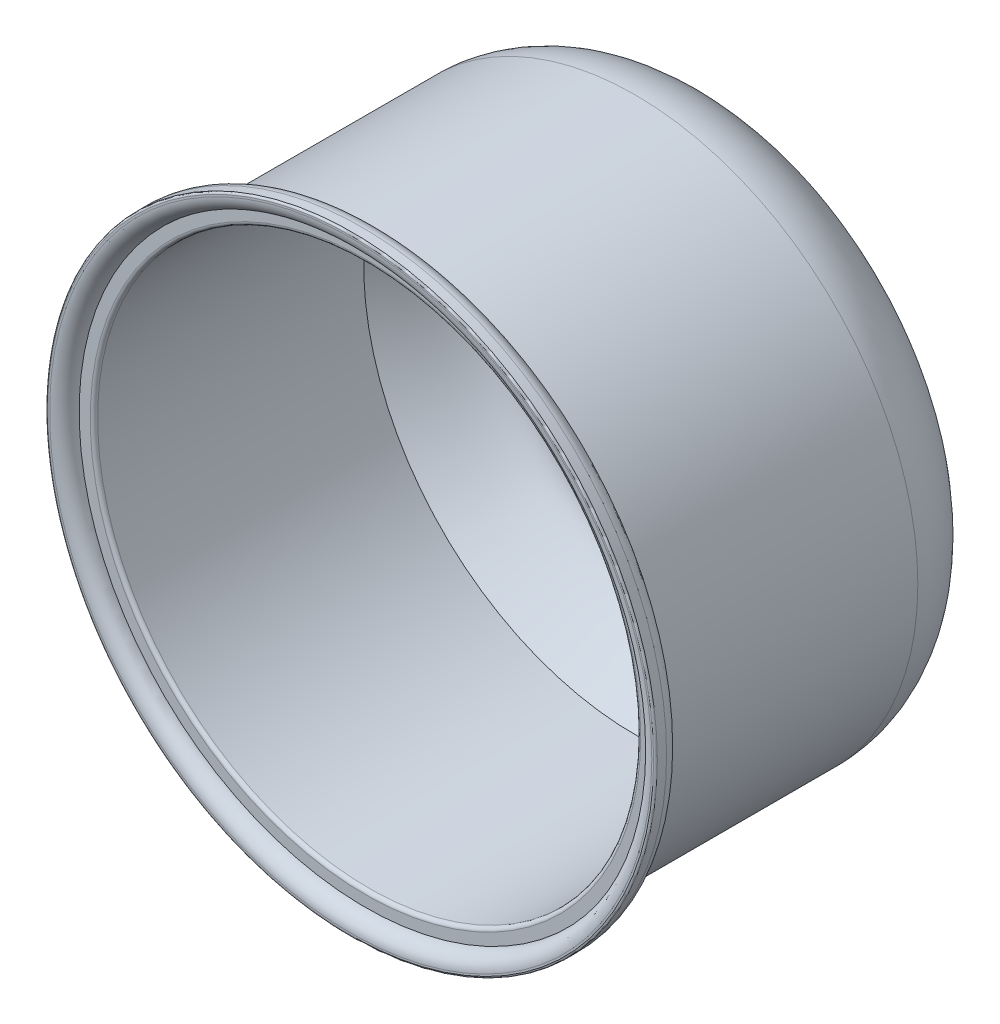
ISO-10303-21;
HEADER;
FILE_DESCRIPTION(('STEP AP214'),'2;1');
FILE_NAME('part.step','',(''),(''),'','','');
FILE_SCHEMA(('AUTOMOTIVE_DESIGN { 1 0 10303 214 1 1 1 1 }'));
ENDSEC;
DATA;
#1=APPLICATION_CONTEXT('core data for automotive mechanical design processes');
#2=APPLICATION_PROTOCOL_DEFINITION('international standard','automotive_design',2000,#1);
#3=PRODUCT_CONTEXT('',#1,'mechanical');
#4=PRODUCT('Part','Part','',(#3));
#5=PRODUCT_RELATED_PRODUCT_CATEGORY('part','',(#4));
#6=PRODUCT_DEFINITION_FORMATION('','',#4);
#7=PRODUCT_DEFINITION_CONTEXT('part definition',#1,'design');
#8=PRODUCT_DEFINITION('design','',#6,#7);
#9=PRODUCT_DEFINITION_SHAPE('','',#8);
#10=(LENGTH_UNIT() NAMED_UNIT(*) SI_UNIT(.MILLI.,.METRE.));
#11=(NAMED_UNIT(*) PLANE_ANGLE_UNIT() SI_UNIT($,.RADIAN.));
#12=(NAMED_UNIT(*) SI_UNIT($,.STERADIAN.) SOLID_ANGLE_UNIT());
#13=UNCERTAINTY_MEASURE_WITH_UNIT(LENGTH_MEASURE(1.E-05),#10,'distance_accuracy_value','');
#14=(GEOMETRIC_REPRESENTATION_CONTEXT(3) GLOBAL_UNCERTAINTY_ASSIGNED_CONTEXT((#13)) GLOBAL_UNIT_ASSIGNED_CONTEXT((#10,
#11,#12)) REPRESENTATION_CONTEXT('',''));
#15=CARTESIAN_POINT('',(0.,0.,0.));
#16=DIRECTION('',(0.,0.,1.));
#17=DIRECTION('',(1.,0.,0.));
#18=AXIS2_PLACEMENT_3D('',#15,#16,#17);
#19=CARTESIAN_POINT('',(0.,0.,100.));
#20=DIRECTION('',(0.,0.,-1.));
#21=DIRECTION('',(-1.,0.,0.));
#22=AXIS2_PLACEMENT_3D('',#19,#20,#21);
#23=CYLINDRICAL_SURFACE('',#22,82.5);
#24=CARTESIAN_POINT('',(0.,0.,99.5));
#25=DIRECTION('',(0.,0.,1.));
#26=DIRECTION('',(1.,0.,0.));
#27=AXIS2_PLACEMENT_3D('',#24,#25,#26);
#28=CIRCLE('',#27,82.5);
#29=CARTESIAN_POINT('',(-82.5,0.,99.5));
#30=VERTEX_POINT('',#29);
#31=EDGE_CURVE('E11',#30,#30,#28,.F.);
#32=CARTESIAN_POINT('',(0.,0.,97.));
#33=DIRECTION('',(0.,0.,-1.));
#34=DIRECTION('',(-1.,0.,0.));
#35=AXIS2_PLACEMENT_3D('',#32,#33,#34);
#36=CIRCLE('',#35,82.5);
#37=CARTESIAN_POINT('',(-82.5,0.,97.));
#38=VERTEX_POINT('',#37);
#39=EDGE_CURVE('E59',#38,#38,#36,.F.);
#40=CARTESIAN_POINT('',(-82.5,0.,99.5));
#41=CARTESIAN_POINT('',(-82.5,0.,99.4739583333333));
#42=CARTESIAN_POINT('',(-82.5,0.,99.4479166666666));
#43=CARTESIAN_POINT('',(-82.5,0.,99.3958333333333));
#44=CARTESIAN_POINT('',(-82.5,0.,99.3697916666667));
#45=CARTESIAN_POINT('',(-82.5,0.,99.3177083333333));
#46=CARTESIAN_POINT('',(-82.5,0.,99.2916666666667));
#47=CARTESIAN_POINT('',(-82.5,0.,99.2395833333333));
#48=CARTESIAN_POINT('',(-82.5,0.,99.2135416666667));
#49=CARTESIAN_POINT('',(-82.5,0.,99.1614583333333));
#50=CARTESIAN_POINT('',(-82.5,0.,99.1354166666667));
#51=CARTESIAN_POINT('',(-82.5,0.,99.0833333333333));
#52=CARTESIAN_POINT('',(-82.5,0.,99.0572916666667));
#53=CARTESIAN_POINT('',(-82.5,0.,99.0052083333333));
#54=CARTESIAN_POINT('',(-82.5,0.,98.9791666666667));
#55=CARTESIAN_POINT('',(-82.5,0.,98.9270833333333));
#56=CARTESIAN_POINT('',(-82.5,0.,98.9010416666667));
#57=CARTESIAN_POINT('',(-82.5,0.,98.8489583333333));
#58=CARTESIAN_POINT('',(-82.5,0.,98.8229166666667));
#59=CARTESIAN_POINT('',(-82.5,0.,98.7708333333333));
#60=CARTESIAN_POINT('',(-82.5,0.,98.7447916666667));
#61=CARTESIAN_POINT('',(-82.5,0.,98.6927083333333));
#62=CARTESIAN_POINT('',(-82.5,0.,98.6666666666667));
#63=CARTESIAN_POINT('',(-82.5,0.,98.6145833333333));
#64=CARTESIAN_POINT('',(-82.5,0.,98.5885416666667));
#65=CARTESIAN_POINT('',(-82.5,0.,98.5364583333333));
#66=CARTESIAN_POINT('',(-82.5,0.,98.5104166666667));
#67=CARTESIAN_POINT('',(-82.5,0.,98.4583333333333));
#68=CARTESIAN_POINT('',(-82.5,0.,98.4322916666667));
#69=CARTESIAN_POINT('',(-82.5,0.,98.3802083333333));
#70=CARTESIAN_POINT('',(-82.5,0.,98.3541666666667));
#71=CARTESIAN_POINT('',(-82.5,0.,98.3020833333333));
#72=CARTESIAN_POINT('',(-82.5,0.,98.2760416666667));
#73=CARTESIAN_POINT('',(-82.5,0.,98.2239583333333));
#74=CARTESIAN_POINT('',(-82.5,0.,98.1979166666667));
#75=CARTESIAN_POINT('',(-82.5,0.,98.1458333333333));
#76=CARTESIAN_POINT('',(-82.5,0.,98.1197916666667));
#77=CARTESIAN_POINT('',(-82.5,0.,98.0677083333333));
#78=CARTESIAN_POINT('',(-82.5,0.,98.0416666666667));
#79=CARTESIAN_POINT('',(-82.5,0.,97.9895833333333));
#80=CARTESIAN_POINT('',(-82.5,0.,97.9635416666667));
#81=CARTESIAN_POINT('',(-82.5,0.,97.9114583333333));
#82=CARTESIAN_POINT('',(-82.5,0.,97.8854166666667));
#83=CARTESIAN_POINT('',(-82.5,0.,97.8333333333333));
#84=CARTESIAN_POINT('',(-82.5,0.,97.8072916666667));
#85=CARTESIAN_POINT('',(-82.5,0.,97.7552083333333));
#86=CARTESIAN_POINT('',(-82.5,0.,97.7291666666667));
#87=CARTESIAN_POINT('',(-82.5,0.,97.6770833333333));
#88=CARTESIAN_POINT('',(-82.5,0.,97.6510416666667));
#89=CARTESIAN_POINT('',(-82.5,0.,97.5989583333333));
#90=CARTESIAN_POINT('',(-82.5,0.,97.5729166666667));
#91=CARTESIAN_POINT('',(-82.5,0.,97.5208333333333));
#92=CARTESIAN_POINT('',(-82.5,0.,97.4947916666667));
#93=CARTESIAN_POINT('',(-82.5,0.,97.4427083333333));
#94=CARTESIAN_POINT('',(-82.5,0.,97.4166666666667));
#95=CARTESIAN_POINT('',(-82.5,0.,97.3645833333333));
#96=CARTESIAN_POINT('',(-82.5,0.,97.3385416666667));
#97=CARTESIAN_POINT('',(-82.5,0.,97.2864583333333));
#98=CARTESIAN_POINT('',(-82.5,0.,97.2604166666667));
#99=CARTESIAN_POINT('',(-82.5,0.,97.2083333333333));
#100=CARTESIAN_POINT('',(-82.5,0.,97.1822916666667));
#101=CARTESIAN_POINT('',(-82.5,0.,97.1302083333333));
#102=CARTESIAN_POINT('',(-82.5,0.,97.1041666666667));
#103=CARTESIAN_POINT('',(-82.5,0.,97.0520833333333));
#104=CARTESIAN_POINT('',(-82.5,0.,97.0260416666667));
#105=CARTESIAN_POINT('',(-82.5,0.,97.));
#106=B_SPLINE_CURVE_WITH_KNOTS('',3,(#40,#41,#42,#43,#44,#45,#46,#47,#48,#49,#50,#51,#52,#53,
#54,#55,#56,#57,#58,#59,#60,#61,#62,#63,#64,#65,#66,#67,#68,#69,#70,#71,#72,#73,#74,#75,#76,#77,
#78,#79,#80,#81,#82,#83,#84,#85,#86,#87,#88,#89,#90,#91,#92,#93,#94,#95,#96,#97,#98,#99,#100,
#101,#102,#103,#104,#105),.UNSPECIFIED.,.F.,.F.,(4,2,2,2,2,2,2,2,2,2,2,2,2,2,2,2,2,2,2,2,2,2,2,
2,2,2,2,2,2,2,2,2,4),(0.,0.0781250000000122,0.156250000000011,0.234375000000009,
0.312500000000007,0.390625000000006,0.468750000000004,0.546875000000002,0.625000000000001,
0.703124999999999,0.781249999999997,0.859374999999996,0.937499999999994,1.01562499999999,
1.09374999999999,1.17187499999999,1.24999999999999,1.328125,1.40625,1.484375,1.56249999999999,
1.64062499999999,1.71874999999999,1.79687499999999,1.87499999999999,1.95312499999999,
2.03124999999998,2.10937499999998,2.18749999999998,2.26562499999998,2.34374999999998,
2.42187499999998,2.49999999999997),.UNSPECIFIED.);
#107=EDGE_CURVE('BSEAM48',#30,#38,#106,.T.);
#108=ORIENTED_EDGE('',*,*,#31,.T.);
#109=ORIENTED_EDGE('',*,*,#39,.T.);
#110=ORIENTED_EDGE('',*,*,#107,.T.);
#111=ORIENTED_EDGE('',*,*,#107,.F.);
#112=EDGE_LOOP('',(#108,#110,#109,#111));
#113=FACE_BOUND('',#112,.T.);
#114=ADVANCED_FACE('F48',(#113),#23,.T.);
#115=CARTESIAN_POINT('',(0.,0.,100.));
#116=DIRECTION('',(0.,0.,1.));
#117=DIRECTION('',(1.,0.,0.));
#118=AXIS2_PLACEMENT_3D('',#115,#116,#117);
#119=PLANE('',#118);
#120=CARTESIAN_POINT('',(0.,0.,100.));
#121=DIRECTION('',(0.,0.,1.));
#122=DIRECTION('',(1.,0.,0.));
#123=AXIS2_PLACEMENT_3D('',#120,#121,#122);
#124=CIRCLE('',#123,82.);
#125=CARTESIAN_POINT('',(82.,0.,100.));
#126=VERTEX_POINT('',#125);
#127=EDGE_CURVE('E55',#126,#126,#124,.T.);
#128=ORIENTED_EDGE('',*,*,#127,.T.);
#129=EDGE_LOOP('',(#128));
#130=FACE_BOUND('',#129,.T.);
#131=CARTESIAN_POINT('',(0.,0.,100.));
#132=DIRECTION('',(0.,0.,1.));
#133=DIRECTION('',(1.,0.,0.));
#134=AXIS2_PLACEMENT_3D('',#131,#132,#133);
#135=CIRCLE('',#134,81.5);
#136=CARTESIAN_POINT('',(81.5,0.,100.));
#137=VERTEX_POINT('',#136);
#138=EDGE_CURVE('E74',#137,#137,#135,.F.);
#139=ORIENTED_EDGE('',*,*,#138,.T.);
#140=EDGE_LOOP('',(#139));
#141=FACE_BOUND('',#140,.T.);
#142=ADVANCED_FACE('F113',(#130,#141),#119,.T.);
#143=CARTESIAN_POINT('',(0.,0.,96.));
#144=DIRECTION('',(0.,0.,1.));
#145=DIRECTION('',(1.,0.,0.));
#146=AXIS2_PLACEMENT_3D('',#143,#144,#145);
#147=PLANE('',#146);
#148=CARTESIAN_POINT('',(0.,0.,96.));
#149=DIRECTION('',(0.,0.,1.));
#150=DIRECTION('',(1.,0.,0.));
#151=AXIS2_PLACEMENT_3D('',#148,#149,#150);
#152=CIRCLE('',#151,74.5);
#153=CARTESIAN_POINT('',(74.5,0.,96.));
#154=VERTEX_POINT('',#153);
#155=EDGE_CURVE('E80',#154,#154,#152,.F.);
#156=ORIENTED_EDGE('',*,*,#155,.T.);
#157=EDGE_LOOP('',(#156));
#158=FACE_BOUND('',#157,.T.);
#159=CARTESIAN_POINT('',(0.,0.,96.));
#160=DIRECTION('',(0.,0.,1.));
#161=DIRECTION('',(1.,0.,0.));
#162=AXIS2_PLACEMENT_3D('',#159,#160,#161);
#163=CIRCLE('',#162,77.5);
#164=CARTESIAN_POINT('',(77.5,0.,96.));
#165=VERTEX_POINT('',#164);
#166=EDGE_CURVE('E135',#165,#165,#163,.T.);
#167=ORIENTED_EDGE('',*,*,#166,.T.);
#168=EDGE_LOOP('',(#167));
#169=FACE_BOUND('',#168,.T.);
#170=ADVANCED_FACE('F111',(#158,#169),#147,.T.);
#171=CARTESIAN_POINT('',(0.,0.,2.99999999999999));
#172=DIRECTION('',(0.,0.,1.));
#173=DIRECTION('',(1.,0.,0.));
#174=AXIS2_PLACEMENT_3D('',#171,#172,#173);
#175=PLANE('',#174);
#176=CARTESIAN_POINT('',(-46.6209359721925,-26.243824589353,2.99999999999999));
#177=CARTESIAN_POINT('',(-50.2749874513912,-19.752571781638,2.99999999999999));
#178=CARTESIAN_POINT('',(-52.7354392961135,-12.7423103192489,2.99999999999999));
#179=CARTESIAN_POINT('',(-53.9762857381079,-5.42869766770608,2.99999999999999));
#180=CARTESIAN_POINT('',(-53.9708403335559,3.02993818963954,2.99999999999999));
#181=CARTESIAN_POINT('',(-52.3045074981745,11.3214377310532,2.99999999999999));
#182=CARTESIAN_POINT('',(-52.0716533077258,12.3493977974518,2.99999999999999));
#183=CARTESIAN_POINT('',(-49.9765621798691,20.6259205836867,2.99999999999999));
#184=CARTESIAN_POINT('',(-46.2997607698573,28.279412700409,2.99999999999999));
#185=CARTESIAN_POINT('',(-42.0056666025258,34.3283287348322,2.99999999999999));
#186=CARTESIAN_POINT('',(-36.0206573457235,40.3056370266641,2.99999999999999));
#187=CARTESIAN_POINT('',(-28.9794065461727,44.9903373309908,2.99999999999999));
#188=CARTESIAN_POINT('',(-28.0878762353394,45.5525620876363,2.99999999999999));
#189=CARTESIAN_POINT('',(-20.7540377048363,49.9234943307166,2.99999999999999));
#190=CARTESIAN_POINT('',(-12.7423103192492,52.7354392961134,2.99999999999999));
#191=CARTESIAN_POINT('',(-5.42869766770606,53.9762857381082,2.99999999999999));
#192=CARTESIAN_POINT('',(3.02993818963956,53.9708403335559,2.99999999999999));
#193=CARTESIAN_POINT('',(11.3214377310533,52.3045074981745,2.99999999999999));
#194=CARTESIAN_POINT('',(12.3493977974519,52.0716533077258,2.99999999999999));
#195=CARTESIAN_POINT('',(21.6604859319662,49.7146757888869,2.99999999999999));
#196=CARTESIAN_POINT('',(30.1830508753785,45.3558461941964,2.99999999999999));
#197=CARTESIAN_POINT('',(36.8805564153776,40.0997992841534,2.99999999999999));
#198=CARTESIAN_POINT('',(42.4448771388227,33.6623992267415,2.99999999999999));
#199=CARTESIAN_POINT('',(50.2749874513912,19.752571781638,2.99999999999999));
#200=CARTESIAN_POINT('',(52.7354392961133,12.7423103192491,2.99999999999999));
#201=CARTESIAN_POINT('',(53.9762857381079,5.42869766770607,2.99999999999999));
#202=CARTESIAN_POINT('',(53.9708403335559,-3.02993818963954,2.99999999999999));
#203=CARTESIAN_POINT('',(52.3045074981745,-11.3214377310532,2.99999999999999));
#204=CARTESIAN_POINT('',(52.0716533077258,-12.3493977974518,2.99999999999999));
#205=CARTESIAN_POINT('',(49.9765621798691,-20.6259205836867,2.99999999999999));
#206=CARTESIAN_POINT('',(46.2997607698573,-28.279412700409,2.99999999999999));
#207=CARTESIAN_POINT('',(42.0056666025258,-34.3283287348324,2.99999999999999));
#208=CARTESIAN_POINT('',(36.0206573457237,-40.3056370266639,2.99999999999999));
#209=CARTESIAN_POINT('',(28.9794065461729,-44.9903373309907,2.99999999999999));
#210=CARTESIAN_POINT('',(28.0878762353395,-45.5525620876362,2.99999999999999));
#211=CARTESIAN_POINT('',(20.7540377048364,-49.9234943307166,2.99999999999999));
#212=CARTESIAN_POINT('',(12.7423103192497,-52.735439296113,2.99999999999999));
#213=CARTESIAN_POINT('',(5.42869766770613,-53.9762857381079,2.99999999999999));
#214=CARTESIAN_POINT('',(-3.02993818963937,-53.9708403335559,2.99999999999999));
#215=CARTESIAN_POINT('',(-11.3214377310531,-52.3045074981745,2.99999999999999));
#216=CARTESIAN_POINT('',(-12.3493977974517,-52.0716533077258,2.99999999999999));
#217=CARTESIAN_POINT('',(-21.660485931966,-49.714675788887,2.99999999999999));
#218=CARTESIAN_POINT('',(-30.1830508753781,-45.3558461941957,2.99999999999999));
#219=CARTESIAN_POINT('',(-36.8805564153775,-40.0997992841533,2.99999999999999));
#220=CARTESIAN_POINT('',(-42.4448771388225,-33.6623992267416,2.99999999999999));
#221=CARTESIAN_POINT('',(-46.6209359721925,-26.243824589353,2.99999999999999));
#222=B_SPLINE_CURVE_WITH_KNOTS('',5,(#176,#177,#178,#179,#180,#181,#182,#183,#184,#185,#186,
#187,#188,#189,#190,#191,#192,#193,#194,#195,#196,#197,#198,#199,#200,#201,#202,#203,#204,#205,
#206,#207,#208,#209,#210,#211,#212,#213,#214,#215,#216,#217,#218,#219,#220,#221),.UNSPECIFIED.,
.T.,.F.,(6,3,3,3,3,3,3,4,3,3,3,3,3,3,6),(0.,0.109375,0.125,0.234375,0.25,0.359375,0.375,0.5,
0.609375,0.625,0.734375,0.75,0.859375,0.875,1.),.UNSPECIFIED.);
#223=CARTESIAN_POINT('',(53.5000244055218,8.64352643278887E-10,2.99999999999999));
#224=VERTEX_POINT('',#223);
#225=EDGE_CURVE('E83',#224,#224,#222,.F.);
#226=ORIENTED_EDGE('',*,*,#225,.T.);
#227=EDGE_LOOP('',(#226));
#228=FACE_BOUND('',#227,.T.);
#229=ADVANCED_FACE('F107',(#228),#175,.T.);
#230=CARTESIAN_POINT('',(-46.6209359721925,-26.243824589353,2.99999999999999));
#231=CARTESIAN_POINT('',(-50.2504815493647,-28.2869658408111,2.99999999999999));
#232=CARTESIAN_POINT('',(-53.8800271265369,-30.3301070922691,2.99999999999999));
#233=CARTESIAN_POINT('',(-57.0672571945108,-32.4825001424338,11.));
#234=CARTESIAN_POINT('',(-60.3650661397843,-34.6075802429219,17.));
#235=CARTESIAN_POINT('',(-63.6628750850579,-36.7326603434099,23.));
#236=CARTESIAN_POINT('',(-42.4448771388225,-33.6623992267416,2.99999999999999));
#237=CARTESIAN_POINT('',(-45.749742571239,-36.2823179896097,2.99999999999999));
#238=CARTESIAN_POINT('',(-49.0546080036554,-38.9022367524777,2.99999999999999));
#239=CARTESIAN_POINT('',(-51.8989021827028,-41.5625743770355,11.));
#240=CARTESIAN_POINT('',(-54.8583391750925,-44.2128072861709,17.));
#241=CARTESIAN_POINT('',(-57.8177761674822,-46.8630401953062,23.));
#242=CARTESIAN_POINT('',(-36.8805564153775,-40.0997992841533,2.99999999999999));
#243=CARTESIAN_POINT('',(-39.7652187620559,-43.1477805726425,2.99999999999999));
#244=CARTESIAN_POINT('',(-42.6498811087342,-46.1957618611317,2.99999999999999));
#245=CARTESIAN_POINT('',(-45.0449400223251,-49.3579711225839,11.));
#246=CARTESIAN_POINT('',(-47.5623997941879,-52.4916233907954,17.));
#247=CARTESIAN_POINT('',(-50.0798595660507,-55.6252756590069,23.));
#248=CARTESIAN_POINT('',(-30.1830508753781,-45.3558461941957,2.99999999999999));
#249=CARTESIAN_POINT('',(-32.5746718551765,-48.6959446553221,2.99999999999999));
#250=CARTESIAN_POINT('',(-34.9662928349749,-52.0360431164485,2.99999999999999));
#251=CARTESIAN_POINT('',(-36.8224349694914,-55.6528427987044,11.));
#252=CARTESIAN_POINT('',(-38.8124468153284,-59.2004671756778,17.));
#253=CARTESIAN_POINT('',(-40.8024586611654,-62.7480915526513,23.));
#254=CARTESIAN_POINT('',(-21.660485931966,-49.714675788887,2.99999999999999));
#255=CARTESIAN_POINT('',(-23.4410125500605,-53.2448333840287,2.99999999999999));
#256=CARTESIAN_POINT('',(-25.221539168155,-56.7749909791704,2.99999999999999));
#257=CARTESIAN_POINT('',(-26.3892033191668,-60.8036542033107,11.));
#258=CARTESIAN_POINT('',(-27.7100830869494,-64.7076910202014,17.));
#259=CARTESIAN_POINT('',(-29.0309628547319,-68.611727837092,23.));
#260=CARTESIAN_POINT('',(-12.3493977974517,-52.0716533077258,2.99999999999999));
#261=CARTESIAN_POINT('',(-13.4840646494936,-55.6521373325497,2.99999999999999));
#262=CARTESIAN_POINT('',(-14.6187315015354,-59.2326213573736,2.99999999999999));
#263=CARTESIAN_POINT('',(-15.0264784688634,-63.5089993790976,11.));
#264=CARTESIAN_POINT('',(-15.6159554073699,-67.6114039015965,17.));
#265=CARTESIAN_POINT('',(-16.2054323458763,-71.7138084240955,23.));
#266=CARTESIAN_POINT('',(-11.3214377310531,-52.3045074981745,2.99999999999999));
#267=CARTESIAN_POINT('',(-12.3839574903203,-55.8888831940925,2.99999999999999));
#268=CARTESIAN_POINT('',(-13.4464772495875,-59.4732588900105,2.99999999999999));
#269=CARTESIAN_POINT('',(-13.7713307772548,-63.7745591107291,11.));
#270=CARTESIAN_POINT('',(-14.2806008628221,-67.8966282002476,17.));
#271=CARTESIAN_POINT('',(-14.7898709483893,-72.0186972897661,23.));
#272=CARTESIAN_POINT('',(-3.02993818963937,-53.9708403335559,2.99999999999999));
#273=CARTESIAN_POINT('',(-3.51255648214684,-57.57294768833,2.99999999999999));
#274=CARTESIAN_POINT('',(-3.99517477465431,-61.1750550431041,2.99999999999999));
#275=CARTESIAN_POINT('',(-3.65061304843024,-65.6593616431291,11.));
#276=CARTESIAN_POINT('',(-3.51284632688906,-69.9231184318414,17.));
#277=CARTESIAN_POINT('',(-3.37507960534788,-74.1868752205537,23.));
#278=CARTESIAN_POINT('',(5.42869766770613,-53.9762857381079,2.99999999999999));
#279=CARTESIAN_POINT('',(5.54494305597892,-57.4905072766655,2.99999999999999));
#280=CARTESIAN_POINT('',(5.66118844425171,-61.0047288152232,2.99999999999999));
#281=CARTESIAN_POINT('',(6.67149895958693,-65.5283784705192,11.));
#282=CARTESIAN_POINT('',(7.45829319315654,-69.7996710966307,17.));
#283=CARTESIAN_POINT('',(8.24508742672615,-74.0709637227421,23.));
#284=CARTESIAN_POINT('',(12.7423103192497,-52.735439296113,2.99999999999999));
#285=CARTESIAN_POINT('',(13.3818824234605,-56.1004520224807,2.99999999999999));
#286=CARTESIAN_POINT('',(14.0214545276714,-59.4654647488483,2.99999999999999));
#287=CARTESIAN_POINT('',(15.594595627883,-63.9101389756569,11.));
#288=CARTESIAN_POINT('',(16.9343444790945,-68.0848978273552,17.));
#289=CARTESIAN_POINT('',(18.2740933303059,-72.2596566790536,23.));
#290=CARTESIAN_POINT('',(20.7540377048364,-49.9234943307166,2.99999999999999));
#291=CARTESIAN_POINT('',(21.9735535362922,-53.0451209098396,2.99999999999999));
#292=CARTESIAN_POINT('',(23.193069367748,-56.1667474889625,2.99999999999999));
#293=CARTESIAN_POINT('',(25.3676259088548,-60.3876681160923,11.));
#294=CARTESIAN_POINT('',(27.3034222725488,-64.3337652312204,17.));
#295=CARTESIAN_POINT('',(29.2392186362428,-68.2798623463484,23.));
#296=CARTESIAN_POINT('',(28.0878762353395,-45.5525620876362,2.99999999999999));
#297=CARTESIAN_POINT('',(29.8467507759793,-48.3587053305547,2.99999999999999));
#298=CARTESIAN_POINT('',(31.6056253166191,-51.1648485734732,2.99999999999999));
#299=CARTESIAN_POINT('',(34.3117399368682,-55.0049970335881,11.));
#300=CARTESIAN_POINT('',(36.781044537215,-58.586644189404,17.));
#301=CARTESIAN_POINT('',(39.2503491375618,-62.1682913452198,23.));
#302=CARTESIAN_POINT('',(28.9794065461729,-44.9903373309907,2.99999999999999));
#303=CARTESIAN_POINT('',(30.8050224785772,-47.7559435789952,2.99999999999999));
#304=CARTESIAN_POINT('',(32.6306384109816,-50.5215498269997,2.99999999999999));
#305=CARTESIAN_POINT('',(35.400016334242,-54.3129795531169,11.));
#306=CARTESIAN_POINT('',(37.9334537597884,-57.8479534097059,17.));
#307=CARTESIAN_POINT('',(40.4668911853348,-61.3829272662949,23.));
#308=CARTESIAN_POINT('',(36.0206573457237,-40.3056370266639,2.99999999999999));
#309=CARTESIAN_POINT('',(38.3744223893668,-42.7383342177617,2.99999999999999));
#310=CARTESIAN_POINT('',(40.7281874330099,-45.1710314088595,2.99999999999999));
#311=CARTESIAN_POINT('',(43.9947597980805,-48.553913094888,11.));
#312=CARTESIAN_POINT('',(47.0331303327942,-51.6992486571838,17.));
#313=CARTESIAN_POINT('',(50.0715008675079,-54.8445842194796,23.));
#314=CARTESIAN_POINT('',(42.0056666025258,-34.3283287348324,2.99999999999999));
#315=CARTESIAN_POINT('',(44.8384889919065,-36.3608082923655,2.99999999999999));
#316=CARTESIAN_POINT('',(47.6713113812872,-38.3932878498987,2.99999999999999));
#317=CARTESIAN_POINT('',(51.318717538211,-41.2478462010166,11.));
#318=CARTESIAN_POINT('',(54.7624777532491,-43.8968848537383,17.));
#319=CARTESIAN_POINT('',(58.2062379682871,-46.54592350646,23.));
#320=CARTESIAN_POINT('',(46.2997607698573,-28.279412700409,2.99999999999999));
#321=CARTESIAN_POINT('',(49.4989755039425,-29.9187233559209,2.99999999999999));
#322=CARTESIAN_POINT('',(52.6981902380278,-31.5580340114328,2.99999999999999));
#323=CARTESIAN_POINT('',(56.5858826191465,-33.8763814477878,11.));
#324=CARTESIAN_POINT('',(60.3014555885069,-36.024969688932,17.));
#325=CARTESIAN_POINT('',(64.0170285578673,-38.1735579300762,23.));
#326=CARTESIAN_POINT('',(49.9765621798691,-20.6259205836867,2.99999999999999));
#327=CARTESIAN_POINT('',(53.5168198419937,-21.7765538468311,2.99999999999999));
#328=CARTESIAN_POINT('',(57.0570775041184,-22.9271871099755,2.99999999999999));
#329=CARTESIAN_POINT('',(61.1087563531941,-24.5685471770778,11.));
#330=CARTESIAN_POINT('',(65.0325799055322,-26.0872255431907,17.));
#331=CARTESIAN_POINT('',(68.9564034578702,-27.6059039093036,23.));
#332=CARTESIAN_POINT('',(52.0716533077258,-12.3493977974518,2.99999999999999));
#333=CARTESIAN_POINT('',(55.8443149003073,-12.9775653776834,2.99999999999999));
#334=CARTESIAN_POINT('',(59.6169764928888,-13.6057329579149,2.99999999999999));
#335=CARTESIAN_POINT('',(63.7011769468551,-14.5199791970532,11.));
#336=CARTESIAN_POINT('',(67.7074926854753,-15.3627057714648,17.));
#337=CARTESIAN_POINT('',(71.7138084240954,-16.2054323458764,23.));
#338=CARTESIAN_POINT('',(52.3045074981745,-11.3214377310532,2.99999999999999));
#339=CARTESIAN_POINT('',(56.1044777917496,-11.88379409957,2.99999999999999));
#340=CARTESIAN_POINT('',(59.9044480853248,-12.4461504680867,2.99999999999999));
#341=CARTESIAN_POINT('',(63.9901537083862,-13.2711673865044,11.));
#342=CARTESIAN_POINT('',(68.0044254990761,-14.0305191674469,17.));
#343=CARTESIAN_POINT('',(72.018697289766,-14.7898709483894,23.));
#344=CARTESIAN_POINT('',(53.9708403335559,-3.02993818963954,2.99999999999999));
#345=CARTESIAN_POINT('',(57.9749914647622,-3.06198037914481,2.99999999999999));
#346=CARTESIAN_POINT('',(61.9791425959685,-3.09402256865008,2.99999999999999));
#347=CARTESIAN_POINT('',(66.0614054195613,-3.20003694542817,11.));
#348=CARTESIAN_POINT('',(70.1241403200575,-3.28755827538806,17.));
#349=CARTESIAN_POINT('',(74.1868752205536,-3.37507960534794,23.));
#350=CARTESIAN_POINT('',(53.9762857381079,5.42869766770607,2.99999999999999));
#351=CARTESIAN_POINT('',(58.0674719619226,5.95596933545572,2.99999999999999));
#352=CARTESIAN_POINT('',(62.1586581857373,6.48324100320536,2.99999999999999));
#353=CARTESIAN_POINT('',(66.1053431557763,7.08252523906372,11.));
#354=CARTESIAN_POINT('',(70.0881534392592,7.6638063328949,17.));
#355=CARTESIAN_POINT('',(74.0709637227421,8.24508742672608,23.));
#356=CARTESIAN_POINT('',(52.7354392961133,12.7423103192491,2.99999999999999));
#357=CARTESIAN_POINT('',(56.7978945650731,13.7726298344003,2.99999999999999));
#358=CARTESIAN_POINT('',(60.860349834033,14.8029493495515,2.99999999999999));
#359=CARTESIAN_POINT('',(64.6075815182497,15.985343038823,11.));
#360=CARTESIAN_POINT('',(68.4336190986522,17.1297181845645,17.));
#361=CARTESIAN_POINT('',(72.2596566790547,18.2740933303059,23.));
#362=CARTESIAN_POINT('',(50.2749874513912,19.752571781638,2.99999999999999));
#363=CARTESIAN_POINT('',(54.188628154755,21.2910327101425,2.99999999999999));
#364=CARTESIAN_POINT('',(58.1022688581187,22.8294936386471,2.99999999999999));
#365=CARTESIAN_POINT('',(61.5895678293731,24.5374351866876,11.));
#366=CARTESIAN_POINT('',(65.1834522336549,26.2030065798441,17.));
#367=CARTESIAN_POINT('',(68.7773366379366,27.8685779730006,23.));
#368=CARTESIAN_POINT('',(42.4448771388227,33.6623992267415,2.99999999999999));
#369=CARTESIAN_POINT('',(45.749742571776,36.2823179901463,2.99999999999999));
#370=CARTESIAN_POINT('',(49.0546080047293,38.9022367535512,2.99999999999999));
#371=CARTESIAN_POINT('',(51.8989021832398,41.5625743775722,11.));
#372=CARTESIAN_POINT('',(54.858339175361,44.2128072864391,17.));
#373=CARTESIAN_POINT('',(57.8177761674822,46.8630401953061,23.));
#374=CARTESIAN_POINT('',(36.8805564153776,40.0997992841534,2.99999999999999));
#375=CARTESIAN_POINT('',(39.7652187629283,43.147780573515,2.99999999999999));
#376=CARTESIAN_POINT('',(42.6498811104791,46.1957618628765,2.99999999999999));
#377=CARTESIAN_POINT('',(45.0449400231978,49.3579711234562,11.));
#378=CARTESIAN_POINT('',(47.5623997946245,52.4916233912314,17.));
#379=CARTESIAN_POINT('',(50.0798595660513,55.6252756590065,23.));
#380=CARTESIAN_POINT('',(30.1830508753785,45.3558461941964,2.99999999999999));
#381=CARTESIAN_POINT('',(32.574671856217,48.6959446563629,2.99999999999999));
#382=CARTESIAN_POINT('',(34.9662928370555,52.0360431185294,2.99999999999999));
#383=CARTESIAN_POINT('',(36.8224349705318,55.6528427997447,11.));
#384=CARTESIAN_POINT('',(38.8124468158486,59.2004671761979,17.));
#385=CARTESIAN_POINT('',(40.8024586611654,62.7480915526511,23.));
#386=CARTESIAN_POINT('',(21.6604859319662,49.7146757888869,2.99999999999999));
#387=CARTESIAN_POINT('',(23.4410125511385,53.2448333851064,2.99999999999999));
#388=CARTESIAN_POINT('',(25.2215391703109,56.774990981326,2.99999999999999));
#389=CARTESIAN_POINT('',(26.3892033202449,60.8036542043884,11.));
#390=CARTESIAN_POINT('',(27.7100830874884,64.7076910207402,17.));
#391=CARTESIAN_POINT('',(29.030962854732,68.6117278370919,23.));
#392=CARTESIAN_POINT('',(12.3493977974519,52.0716533077258,2.99999999999999));
#393=CARTESIAN_POINT('',(13.484064650482,55.6521373335379,2.99999999999999));
#394=CARTESIAN_POINT('',(14.618731503512,59.23262135935,2.99999999999999));
#395=CARTESIAN_POINT('',(15.0264784698518,63.5089993800858,11.));
#396=CARTESIAN_POINT('',(15.6159554078641,67.6114039020906,17.));
#397=CARTESIAN_POINT('',(16.2054323458765,71.7138084240954,23.));
#398=CARTESIAN_POINT('',(11.3214377310533,52.3045074981745,2.99999999999999));
#399=CARTESIAN_POINT('',(12.3839574912972,55.8888831950692,2.99999999999999));
#400=CARTESIAN_POINT('',(13.4464772515412,59.4732588919639,2.99999999999999));
#401=CARTESIAN_POINT('',(13.7713307782317,63.7745591117058,11.));
#402=CARTESIAN_POINT('',(14.2806008633106,67.8966282007359,17.));
#403=CARTESIAN_POINT('',(14.7898709483894,72.018697289766,23.));
#404=CARTESIAN_POINT('',(3.02993818963956,53.9708403335559,2.99999999999999));
#405=CARTESIAN_POINT('',(3.51255648302051,57.5729476892034,2.99999999999999));
#406=CARTESIAN_POINT('',(3.99517477640145,61.1750550448509,2.99999999999999));
#407=CARTESIAN_POINT('',(3.65061304930386,65.6593616440025,11.));
#408=CARTESIAN_POINT('',(3.51284632732591,69.9231184322781,17.));
#409=CARTESIAN_POINT('',(3.37507960534796,74.1868752205536,23.));
#410=CARTESIAN_POINT('',(-5.42869766770606,53.9762857381082,2.99999999999999));
#411=CARTESIAN_POINT('',(-5.54494305529672,57.490507277348,2.99999999999999));
#412=CARTESIAN_POINT('',(-5.66118844288739,61.0047288165877,2.99999999999999));
#413=CARTESIAN_POINT('',(-6.67149895890472,65.5283784712015,11.));
#414=CARTESIAN_POINT('',(-7.45829319281538,69.7996710969718,17.));
#415=CARTESIAN_POINT('',(-8.24508742672605,74.0709637227421,23.));
#416=CARTESIAN_POINT('',(-12.7423103192492,52.7354392961134,2.99999999999999));
#417=CARTESIAN_POINT('',(-13.3818824229904,56.1004520229508,2.99999999999999));
#418=CARTESIAN_POINT('',(-14.0214545267315,59.4654647497881,2.99999999999999));
#419=CARTESIAN_POINT('',(-15.594595627413,63.9101389761273,11.));
#420=CARTESIAN_POINT('',(-16.9343444788594,68.084897827591,17.));
#421=CARTESIAN_POINT('',(-18.2740933303058,72.2596566790548,23.));
#422=CARTESIAN_POINT('',(-20.7540377048363,49.9234943307166,2.99999999999999));
#423=CARTESIAN_POINT('',(-21.9735535360908,53.0451209100409,2.99999999999999));
#424=CARTESIAN_POINT('',(-23.1930693673453,56.1667474893651,2.99999999999999));
#425=CARTESIAN_POINT('',(-25.3676259086534,60.3876681162936,11.));
#426=CARTESIAN_POINT('',(-27.303422272448,64.333765231321,17.));
#427=CARTESIAN_POINT('',(-29.2392186362427,68.2798623463483,23.));
#428=CARTESIAN_POINT('',(-28.0878762353394,45.5525620876363,2.99999999999999));
#429=CARTESIAN_POINT('',(-29.8467507760463,48.3587053304877,2.99999999999999));
#430=CARTESIAN_POINT('',(-31.6056253167531,51.164848573339,2.99999999999999));
#431=CARTESIAN_POINT('',(-34.3117399369352,55.0049970335211,11.));
#432=CARTESIAN_POINT('',(-36.7810445372485,58.5866441893705,17.));
#433=CARTESIAN_POINT('',(-39.2503491375618,62.1682913452199,23.));
#434=CARTESIAN_POINT('',(-28.9794065461727,44.9903373309908,2.99999999999999));
#435=CARTESIAN_POINT('',(-30.8050224786777,47.7559435788947,2.99999999999999));
#436=CARTESIAN_POINT('',(-32.6306384111826,50.5215498267986,2.99999999999999));
#437=CARTESIAN_POINT('',(-35.4000163343425,54.3129795530164,11.));
#438=CARTESIAN_POINT('',(-37.9334537598386,57.8479534096556,17.));
#439=CARTESIAN_POINT('',(-40.4668911853348,61.3829272662949,23.));
#440=CARTESIAN_POINT('',(-36.0206573457235,40.3056370266641,2.99999999999999));
#441=CARTESIAN_POINT('',(-38.374422389734,42.7383342173944,2.99999999999999));
#442=CARTESIAN_POINT('',(-40.7281874337446,45.1710314081248,2.99999999999999));
#443=CARTESIAN_POINT('',(-43.9947597984478,48.5539130945207,11.));
#444=CARTESIAN_POINT('',(-47.0331303329778,51.6992486570002,17.));
#445=CARTESIAN_POINT('',(-50.0715008675079,54.8445842194798,23.));
#446=CARTESIAN_POINT('',(-42.0056666025258,34.3283287348322,2.99999999999999));
#447=CARTESIAN_POINT('',(-44.8384889925283,36.3608082917436,2.99999999999999));
#448=CARTESIAN_POINT('',(-47.6713113825307,38.3932878486551,2.99999999999999));
#449=CARTESIAN_POINT('',(-51.3187175388328,41.2478462003945,11.));
#450=CARTESIAN_POINT('',(-54.7624777535599,43.8968848534269,17.));
#451=CARTESIAN_POINT('',(-58.2062379682871,46.5459235064593,23.));
#452=CARTESIAN_POINT('',(-46.2997607698573,28.279412700409,2.99999999999999));
#453=CARTESIAN_POINT('',(-49.4989755047546,29.9187233551089,2.99999999999999));
#454=CARTESIAN_POINT('',(-52.6981902396519,31.5580340098087,2.99999999999999));
#455=CARTESIAN_POINT('',(-56.5858826199586,33.8763814469759,11.));
#456=CARTESIAN_POINT('',(-60.3014555889129,36.0249696885262,17.));
#457=CARTESIAN_POINT('',(-64.0170285578673,38.1735579300766,23.));
#458=CARTESIAN_POINT('',(-49.9765621798691,20.6259205836867,2.99999999999999));
#459=CARTESIAN_POINT('',(-53.516819842961,21.7765538458639,2.99999999999999));
#460=CARTESIAN_POINT('',(-57.0570775060529,22.927187108041,2.99999999999999));
#461=CARTESIAN_POINT('',(-61.1087563541614,24.5685471761106,11.));
#462=CARTESIAN_POINT('',(-65.0325799060158,26.0872255427071,17.));
#463=CARTESIAN_POINT('',(-68.9564034578701,27.6059039093036,23.));
#464=CARTESIAN_POINT('',(-52.0716533077258,12.3493977974518,2.99999999999999));
#465=CARTESIAN_POINT('',(-55.8443149013291,12.9775653766616,2.99999999999999));
#466=CARTESIAN_POINT('',(-59.6169764949324,13.6057329558714,2.99999999999999));
#467=CARTESIAN_POINT('',(-63.7011769478769,14.5199791960315,11.));
#468=CARTESIAN_POINT('',(-67.7074926859862,15.362705770954,17.));
#469=CARTESIAN_POINT('',(-71.7138084240954,16.2054323458765,23.));
#470=CARTESIAN_POINT('',(-52.3045074981745,11.3214377310532,2.99999999999999));
#471=CARTESIAN_POINT('',(-56.1044777927766,11.883794098543,2.99999999999999));
#472=CARTESIAN_POINT('',(-59.9044480873786,12.4461504660328,2.99999999999999));
#473=CARTESIAN_POINT('',(-63.9901537094132,13.2711673854775,11.));
#474=CARTESIAN_POINT('',(-68.0044254995896,14.0305191669335,17.));
#475=CARTESIAN_POINT('',(-72.0186972897661,14.7898709483895,23.));
#476=CARTESIAN_POINT('',(-53.9708403335559,3.02993818963954,2.99999999999999));
#477=CARTESIAN_POINT('',(-57.974991465817,3.0619803780901,2.99999999999999));
#478=CARTESIAN_POINT('',(-61.979142598078,3.09402256654066,2.99999999999999));
#479=CARTESIAN_POINT('',(-66.0614054206161,3.2000369443735,11.));
#480=CARTESIAN_POINT('',(-70.1241403205849,3.28755827486078,17.));
#481=CARTESIAN_POINT('',(-74.1868752205537,3.37507960534805,23.));
#482=CARTESIAN_POINT('',(-53.9762857381079,-5.42869766770608,2.99999999999999));
#483=CARTESIAN_POINT('',(-58.0674719628919,-5.95596933642499,2.99999999999999));
#484=CARTESIAN_POINT('',(-62.1586581876758,-6.4832410051439,2.99999999999999));
#485=CARTESIAN_POINT('',(-66.1053431567455,-7.08252524003295,11.));
#486=CARTESIAN_POINT('',(-70.0881534397438,-7.66380633337946,17.));
#487=CARTESIAN_POINT('',(-74.0709637227421,-8.24508742672598,23.));
#488=CARTESIAN_POINT('',(-52.7354392961135,-12.7423103192489,2.99999999999999));
#489=CARTESIAN_POINT('',(-56.7978945658587,-13.7726298351854,2.99999999999999));
#490=CARTESIAN_POINT('',(-60.8603498356039,-14.8029493511219,2.99999999999999));
#491=CARTESIAN_POINT('',(-64.6075815190356,-15.9853430396081,11.));
#492=CARTESIAN_POINT('',(-68.4336190990458,-17.129718184957,17.));
#493=CARTESIAN_POINT('',(-72.2596566790559,-18.2740933303058,23.));
#494=CARTESIAN_POINT('',(-50.2749874513912,-19.752571781638,2.99999999999999));
#495=CARTESIAN_POINT('',(-54.1886281552246,-21.2910327106123,2.99999999999999));
#496=CARTESIAN_POINT('',(-58.1022688590581,-22.8294936395866,2.99999999999999));
#497=CARTESIAN_POINT('',(-61.5895678298428,-24.5374351871573,11.));
#498=CARTESIAN_POINT('',(-65.1834522338897,-26.203006580079,17.));
#499=CARTESIAN_POINT('',(-68.7773366379366,-27.8685779730007,23.));
#500=CARTESIAN_POINT('',(-46.6209359721925,-26.243824589353,2.99999999999999));
#501=CARTESIAN_POINT('',(-50.2504815493647,-28.2869658408111,2.99999999999999));
#502=CARTESIAN_POINT('',(-53.8800271265369,-30.3301070922691,2.99999999999999));
#503=CARTESIAN_POINT('',(-57.0672571945108,-32.4825001424338,11.));
#504=CARTESIAN_POINT('',(-60.3650661397843,-34.6075802429219,17.));
#505=CARTESIAN_POINT('',(-63.6628750850579,-36.7326603434099,23.));
#506=B_SPLINE_SURFACE_WITH_KNOTS('',5,5,((#230,#231,#232,#233,#234,#235),(#236,#237,#238,#239,
#240,#241),(#242,#243,#244,#245,#246,#247),(#248,#249,#250,#251,#252,#253),(#254,#255,#256,#257,
#258,#259),(#260,#261,#262,#263,#264,#265),(#266,#267,#268,#269,#270,#271),(#272,#273,#274,#275,
#276,#277),(#278,#279,#280,#281,#282,#283),(#284,#285,#286,#287,#288,#289),(#290,#291,#292,#293,
#294,#295),(#296,#297,#298,#299,#300,#301),(#302,#303,#304,#305,#306,#307),(#308,#309,#310,#311,
#312,#313),(#314,#315,#316,#317,#318,#319),(#320,#321,#322,#323,#324,#325),(#326,#327,#328,#329,
#330,#331),(#332,#333,#334,#335,#336,#337),(#338,#339,#340,#341,#342,#343),(#344,#345,#346,#347,
#348,#349),(#350,#351,#352,#353,#354,#355),(#356,#357,#358,#359,#360,#361),(#362,#363,#364,#365,
#366,#367),(#368,#369,#370,#371,#372,#373),(#374,#375,#376,#377,#378,#379),(#380,#381,#382,#383,
#384,#385),(#386,#387,#388,#389,#390,#391),(#392,#393,#394,#395,#396,#397),(#398,#399,#400,#401,
#402,#403),(#404,#405,#406,#407,#408,#409),(#410,#411,#412,#413,#414,#415),(#416,#417,#418,#419,
#420,#421),(#422,#423,#424,#425,#426,#427),(#428,#429,#430,#431,#432,#433),(#434,#435,#436,#437,
#438,#439),(#440,#441,#442,#443,#444,#445),(#446,#447,#448,#449,#450,#451),(#452,#453,#454,#455,
#456,#457),(#458,#459,#460,#461,#462,#463),(#464,#465,#466,#467,#468,#469),(#470,#471,#472,#473,
#474,#475),(#476,#477,#478,#479,#480,#481),(#482,#483,#484,#485,#486,#487),(#488,#489,#490,#491,
#492,#493),(#494,#495,#496,#497,#498,#499),(#500,#501,#502,#503,#504,#505)),.UNSPECIFIED.,.T.,
.F.,.F.,(6,3,3,3,3,3,3,4,3,3,3,3,3,3,6),(6,6),(0.,0.125,0.140625,0.25,0.265625,0.375,0.390625,
0.5,0.625,0.640625,0.75,0.765625,0.875,0.890625,1.),(0.,1.),.UNSPECIFIED.);
#507=CARTESIAN_POINT('',(0.,0.,23.));
#508=DIRECTION('',(0.,0.,1.));
#509=DIRECTION('',(1.,0.,0.));
#510=AXIS2_PLACEMENT_3D('',#507,#508,#509);
#511=CIRCLE('',#510,73.5);
#512=CARTESIAN_POINT('',(73.5,0.,23.));
#513=VERTEX_POINT('',#512);
#514=EDGE_CURVE('E145',#513,#513,#511,.T.);
#515=ORIENTED_EDGE('',*,*,#514,.T.);
#516=EDGE_LOOP('',(#515));
#517=FACE_BOUND('',#516,.T.);
#518=ORIENTED_EDGE('',*,*,#225,.F.);
#519=EDGE_LOOP('',(#518));
#520=FACE_BOUND('',#519,.T.);
#521=ADVANCED_FACE('F101',(#517,#520),#506,.F.);
#522=CARTESIAN_POINT('',(0.,0.,23.));
#523=DIRECTION('',(0.,0.,1.));
#524=DIRECTION('',(1.,0.,0.));
#525=AXIS2_PLACEMENT_3D('',#522,#523,#524);
#526=CYLINDRICAL_SURFACE('',#525,73.5);
#527=CARTESIAN_POINT('',(0.,0.,95.));
#528=DIRECTION('',(0.,0.,1.));
#529=DIRECTION('',(1.,0.,0.));
#530=AXIS2_PLACEMENT_3D('',#527,#528,#529);
#531=CIRCLE('',#530,73.5);
#532=CARTESIAN_POINT('',(73.5,0.,95.));
#533=VERTEX_POINT('',#532);
#534=EDGE_CURVE('E77',#533,#533,#531,.T.);
#535=ORIENTED_EDGE('',*,*,#534,.T.);
#536=EDGE_LOOP('',(#535));
#537=FACE_BOUND('',#536,.T.);
#538=ORIENTED_EDGE('',*,*,#514,.F.);
#539=EDGE_LOOP('',(#538));
#540=FACE_BOUND('',#539,.T.);
#541=ADVANCED_FACE('F90',(#537,#540),#526,.F.);
#542=CARTESIAN_POINT('',(0.,0.,95.));
#543=DIRECTION('',(0.,0.,1.));
#544=DIRECTION('',(1.,0.,0.));
#545=AXIS2_PLACEMENT_3D('',#542,#543,#544);
#546=TOROIDAL_SURFACE('',#545,74.5,1.);
#547=ORIENTED_EDGE('',*,*,#534,.F.);
#548=EDGE_LOOP('',(#547));
#549=FACE_BOUND('',#548,.T.);
#550=ORIENTED_EDGE('',*,*,#155,.F.);
#551=EDGE_LOOP('',(#550));
#552=FACE_BOUND('',#551,.T.);
#553=ADVANCED_FACE('F100',(#549,#552),#546,.T.);
#554=CARTESIAN_POINT('',(0.,0.,96.));
#555=DIRECTION('',(0.,0.,1.));
#556=DIRECTION('',(1.,0.,0.));
#557=AXIS2_PLACEMENT_3D('',#554,#555,#556);
#558=TOROIDAL_SURFACE('',#557,81.5,4.);
#559=ORIENTED_EDGE('',*,*,#138,.F.);
#560=EDGE_LOOP('',(#559));
#561=FACE_BOUND('',#560,.T.);
#562=ORIENTED_EDGE('',*,*,#166,.F.);
#563=EDGE_LOOP('',(#562));
#564=FACE_BOUND('',#563,.T.);
#565=ADVANCED_FACE('F164',(#561,#564),#558,.T.);
#566=CARTESIAN_POINT('',(0.,0.,93.));
#567=DIRECTION('',(0.,0.,-1.));
#568=DIRECTION('',(-1.,0.,0.));
#569=AXIS2_PLACEMENT_3D('',#566,#567,#568);
#570=PLANE('',#569);
#571=CARTESIAN_POINT('',(0.,0.,93.));
#572=DIRECTION('',(0.,0.,-1.));
#573=DIRECTION('',(-1.,0.,0.));
#574=AXIS2_PLACEMENT_3D('',#571,#572,#573);
#575=CIRCLE('',#574,78.5);
#576=CARTESIAN_POINT('',(-78.5,0.,93.));
#577=VERTEX_POINT('',#576);
#578=EDGE_CURVE('E63',#577,#577,#575,.T.);
#579=ORIENTED_EDGE('',*,*,#578,.T.);
#580=EDGE_LOOP('',(#579));
#581=FACE_BOUND('',#580,.T.);
#582=CARTESIAN_POINT('',(0.,0.,93.));
#583=DIRECTION('',(0.,0.,-1.));
#584=DIRECTION('',(-1.,0.,0.));
#585=AXIS2_PLACEMENT_3D('',#582,#583,#584);
#586=CIRCLE('',#585,76.5);
#587=CARTESIAN_POINT('',(-76.5,0.,93.));
#588=VERTEX_POINT('',#587);
#589=EDGE_CURVE('E154',#588,#588,#586,.T.);
#590=ORIENTED_EDGE('',*,*,#589,.F.);
#591=EDGE_LOOP('',(#590));
#592=FACE_BOUND('',#591,.T.);
#593=ADVANCED_FACE('F162',(#581,#592),#570,.T.);
#594=CARTESIAN_POINT('',(0.,0.,93.));
#595=DIRECTION('',(0.,0.,-1.));
#596=DIRECTION('',(-1.,0.,0.));
#597=AXIS2_PLACEMENT_3D('',#594,#595,#596);
#598=CYLINDRICAL_SURFACE('',#597,76.5);
#599=CARTESIAN_POINT('',(0.,0.,23.));
#600=DIRECTION('',(0.,0.,1.));
#601=DIRECTION('',(1.,0.,0.));
#602=AXIS2_PLACEMENT_3D('',#599,#600,#601);
#603=CIRCLE('',#602,76.5);
#604=CARTESIAN_POINT('',(-76.5,0.,23.));
#605=VERTEX_POINT('',#604);
#606=EDGE_CURVE('E68',#605,#605,#603,.T.);
#607=CARTESIAN_POINT('',(-76.5,0.,23.));
#608=CARTESIAN_POINT('',(-76.5,0.,23.7291666666666));
#609=CARTESIAN_POINT('',(-76.5,0.,24.4583333333333));
#610=CARTESIAN_POINT('',(-76.5,0.,25.9166666666666));
#611=CARTESIAN_POINT('',(-76.5,0.,26.6458333333333));
#612=CARTESIAN_POINT('',(-76.5,0.,28.1041666666667));
#613=CARTESIAN_POINT('',(-76.5,0.,28.8333333333333));
#614=CARTESIAN_POINT('',(-76.5,0.,30.2916666666666));
#615=CARTESIAN_POINT('',(-76.5,0.,31.0208333333333));
#616=CARTESIAN_POINT('',(-76.5,0.,32.4791666666666));
#617=CARTESIAN_POINT('',(-76.5,0.,33.2083333333333));
#618=CARTESIAN_POINT('',(-76.5,0.,34.6666666666666));
#619=CARTESIAN_POINT('',(-76.5,0.,35.3958333333333));
#620=CARTESIAN_POINT('',(-76.5,0.,36.8541666666666));
#621=CARTESIAN_POINT('',(-76.5,0.,37.5833333333333));
#622=CARTESIAN_POINT('',(-76.5,0.,39.0416666666667));
#623=CARTESIAN_POINT('',(-76.5,0.,39.7708333333333));
#624=CARTESIAN_POINT('',(-76.5,0.,41.2291666666667));
#625=CARTESIAN_POINT('',(-76.5,0.,41.9583333333333));
#626=CARTESIAN_POINT('',(-76.5,0.,43.4166666666667));
#627=CARTESIAN_POINT('',(-76.5,0.,44.1458333333333));
#628=CARTESIAN_POINT('',(-76.5,0.,45.6041666666667));
#629=CARTESIAN_POINT('',(-76.5,0.,46.3333333333333));
#630=CARTESIAN_POINT('',(-76.5,0.,47.7916666666667));
#631=CARTESIAN_POINT('',(-76.5,0.,48.5208333333333));
#632=CARTESIAN_POINT('',(-76.5,0.,49.9791666666667));
#633=CARTESIAN_POINT('',(-76.5,0.,50.7083333333333));
#634=CARTESIAN_POINT('',(-76.5,0.,52.1666666666667));
#635=CARTESIAN_POINT('',(-76.5,0.,52.8958333333333));
#636=CARTESIAN_POINT('',(-76.5,0.,54.3541666666667));
#637=CARTESIAN_POINT('',(-76.5,0.,55.0833333333333));
#638=CARTESIAN_POINT('',(-76.5,0.,56.5416666666667));
#639=CARTESIAN_POINT('',(-76.5,0.,57.2708333333333));
#640=CARTESIAN_POINT('',(-76.5,0.,58.7291666666667));
#641=CARTESIAN_POINT('',(-76.5,0.,59.4583333333333));
#642=CARTESIAN_POINT('',(-76.5,0.,60.9166666666667));
#643=CARTESIAN_POINT('',(-76.5,0.,61.6458333333333));
#644=CARTESIAN_POINT('',(-76.5,0.,63.1041666666667));
#645=CARTESIAN_POINT('',(-76.5,0.,63.8333333333333));
#646=CARTESIAN_POINT('',(-76.5,0.,65.2916666666667));
#647=CARTESIAN_POINT('',(-76.5,0.,66.0208333333333));
#648=CARTESIAN_POINT('',(-76.5,0.,67.4791666666667));
#649=CARTESIAN_POINT('',(-76.5,0.,68.2083333333333));
#650=CARTESIAN_POINT('',(-76.5,0.,69.6666666666667));
#651=CARTESIAN_POINT('',(-76.5,0.,70.3958333333333));
#652=CARTESIAN_POINT('',(-76.5,0.,71.8541666666667));
#653=CARTESIAN_POINT('',(-76.5,0.,72.5833333333333));
#654=CARTESIAN_POINT('',(-76.5,0.,74.0416666666667));
#655=CARTESIAN_POINT('',(-76.5,0.,74.7708333333333));
#656=CARTESIAN_POINT('',(-76.5,0.,76.2291666666667));
#657=CARTESIAN_POINT('',(-76.5,0.,76.9583333333333));
#658=CARTESIAN_POINT('',(-76.5,0.,78.4166666666667));
#659=CARTESIAN_POINT('',(-76.5,0.,79.1458333333333));
#660=CARTESIAN_POINT('',(-76.5,0.,80.6041666666667));
#661=CARTESIAN_POINT('',(-76.5,0.,81.3333333333333));
#662=CARTESIAN_POINT('',(-76.5,0.,82.7916666666667));
#663=CARTESIAN_POINT('',(-76.5,0.,83.5208333333333));
#664=CARTESIAN_POINT('',(-76.5,0.,84.9791666666667));
#665=CARTESIAN_POINT('',(-76.5,0.,85.7083333333333));
#666=CARTESIAN_POINT('',(-76.5,0.,87.1666666666667));
#667=CARTESIAN_POINT('',(-76.5,0.,87.8958333333333));
#668=CARTESIAN_POINT('',(-76.5,0.,89.3541666666667));
#669=CARTESIAN_POINT('',(-76.5,0.,90.0833333333333));
#670=CARTESIAN_POINT('',(-76.5,0.,91.5416666666667));
#671=CARTESIAN_POINT('',(-76.5,0.,92.2708333333333));
#672=CARTESIAN_POINT('',(-76.5,0.,93.));
#673=B_SPLINE_CURVE_WITH_KNOTS('',3,(#607,#608,#609,#610,#611,#612,#613,#614,#615,#616,#617,
#618,#619,#620,#621,#622,#623,#624,#625,#626,#627,#628,#629,#630,#631,#632,#633,#634,#635,#636,
#637,#638,#639,#640,#641,#642,#643,#644,#645,#646,#647,#648,#649,#650,#651,#652,#653,#654,#655,
#656,#657,#658,#659,#660,#661,#662,#663,#664,#665,#666,#667,#668,#669,#670,#671,#672),
.UNSPECIFIED.,.F.,.F.,(4,2,2,2,2,2,2,2,2,2,2,2,2,2,2,2,2,2,2,2,2,2,2,2,2,2,2,2,2,2,2,2,4),(0.,
2.1875,4.375,6.5625,8.75,10.9375,13.125,15.3125,17.5,19.6875,21.875,24.0625,26.25,28.4375,
30.625,32.8125,35.,37.1875,39.375,41.5625,43.75,45.9375,48.125,50.3125,52.5,54.6875,56.875,
59.0625,61.25,63.4375,65.625,67.8125,70.),.UNSPECIFIED.);
#674=EDGE_CURVE('BSEAM160',#605,#588,#673,.T.);
#675=ORIENTED_EDGE('',*,*,#606,.T.);
#676=ORIENTED_EDGE('',*,*,#589,.T.);
#677=ORIENTED_EDGE('',*,*,#674,.T.);
#678=ORIENTED_EDGE('',*,*,#674,.F.);
#679=EDGE_LOOP('',(#675,#677,#676,#678));
#680=FACE_BOUND('',#679,.T.);
#681=ADVANCED_FACE('F160',(#680),#598,.T.);
#682=CARTESIAN_POINT('',(0.,0.,0.));
#683=DIRECTION('',(0.,0.,1.));
#684=DIRECTION('',(1.,0.,0.));
#685=AXIS2_PLACEMENT_3D('',#682,#683,#684);
#686=PLANE('',#685);
#687=CARTESIAN_POINT('',(0.,0.,0.));
#688=DIRECTION('',(0.,0.,1.));
#689=DIRECTION('',(1.,0.,0.));
#690=AXIS2_PLACEMENT_3D('',#687,#688,#689);
#691=CIRCLE('',#690,53.5);
#692=CARTESIAN_POINT('',(53.5,0.,0.));
#693=VERTEX_POINT('',#692);
#694=EDGE_CURVE('E71',#693,#693,#691,.F.);
#695=ORIENTED_EDGE('',*,*,#694,.T.);
#696=EDGE_LOOP('',(#695));
#697=FACE_BOUND('',#696,.T.);
#698=ADVANCED_FACE('F171',(#697),#686,.F.);
#699=CARTESIAN_POINT('',(0.,0.,23.));
#700=DIRECTION('',(0.,0.,1.));
#701=DIRECTION('',(1.,0.,0.));
#702=AXIS2_PLACEMENT_3D('',#699,#700,#701);
#703=TOROIDAL_SURFACE('',#702,53.5,23.);
#704=ORIENTED_EDGE('',*,*,#606,.F.);
#705=EDGE_LOOP('',(#704));
#706=FACE_BOUND('',#705,.T.);
#707=ORIENTED_EDGE('',*,*,#694,.F.);
#708=EDGE_LOOP('',(#707));
#709=FACE_BOUND('',#708,.T.);
#710=ADVANCED_FACE('F186',(#706,#709),#703,.T.);
#711=CARTESIAN_POINT('',(0.,0.,97.));
#712=DIRECTION('',(0.,0.,-1.));
#713=DIRECTION('',(-1.,0.,0.));
#714=AXIS2_PLACEMENT_3D('',#711,#712,#713);
#715=TOROIDAL_SURFACE('',#714,78.5,4.);
#716=ORIENTED_EDGE('',*,*,#39,.F.);
#717=EDGE_LOOP('',(#716));
#718=FACE_BOUND('',#717,.T.);
#719=ORIENTED_EDGE('',*,*,#578,.F.);
#720=EDGE_LOOP('',(#719));
#721=FACE_BOUND('',#720,.T.);
#722=ADVANCED_FACE('F188',(#718,#721),#715,.T.);
#723=CARTESIAN_POINT('',(0.,0.,99.5));
#724=DIRECTION('',(0.,0.,1.));
#725=DIRECTION('',(1.,0.,0.));
#726=AXIS2_PLACEMENT_3D('',#723,#724,#725);
#727=TOROIDAL_SURFACE('',#726,82.,0.5);
#728=ORIENTED_EDGE('',*,*,#31,.F.);
#729=EDGE_LOOP('',(#728));
#730=FACE_BOUND('',#729,.T.);
#731=ORIENTED_EDGE('',*,*,#127,.F.);
#732=EDGE_LOOP('',(#731));
#733=FACE_BOUND('',#732,.T.);
#734=ADVANCED_FACE('F50',(#730,#733),#727,.T.);
#735=CLOSED_SHELL('',(#114,#142,#170,#229,#521,#541,#553,#565,#593,#681,#698,#710,#722,#734));
#736=MANIFOLD_SOLID_BREP('B2',#735);
#737=ADVANCED_BREP_SHAPE_REPRESENTATION('',(#18,#736),#14);
#738=SHAPE_DEFINITION_REPRESENTATION(#9,#737);
ENDSEC;
END-ISO-10303-21;
